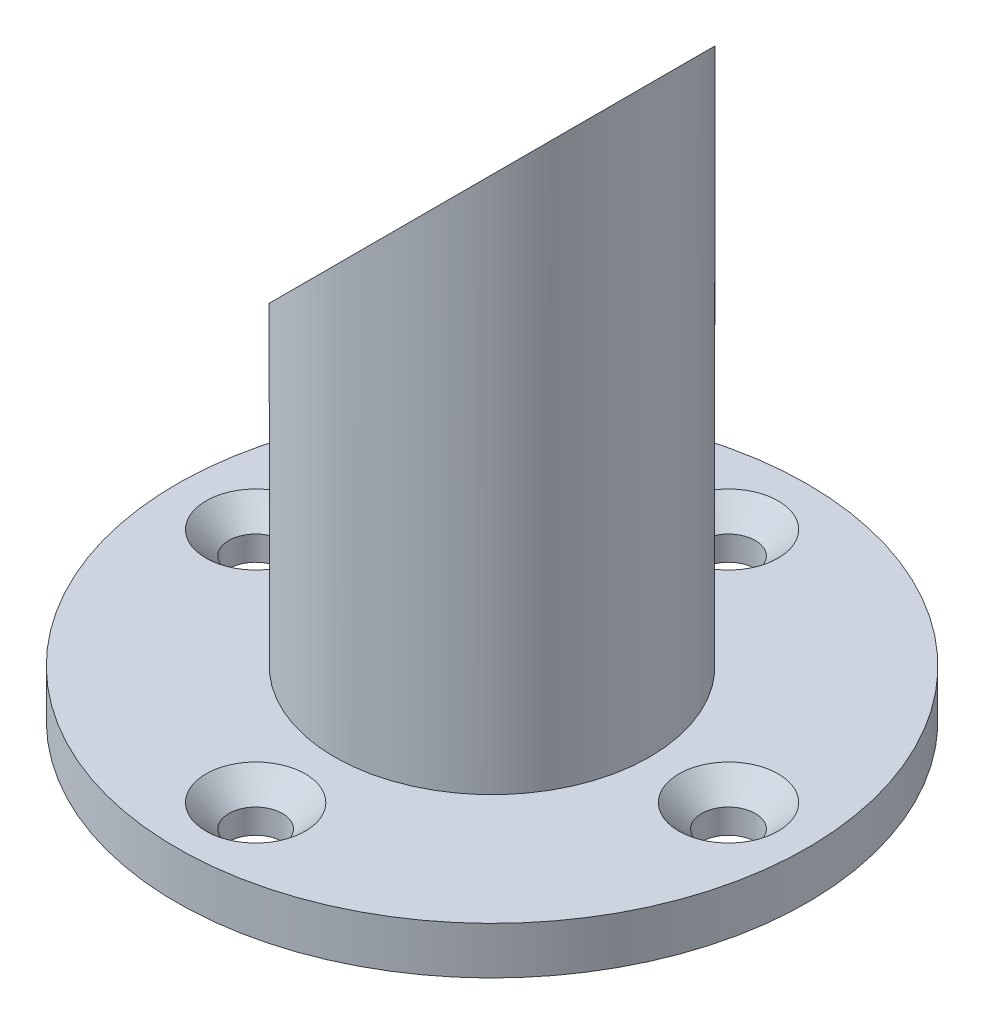
ISO-10303-21;
HEADER;
FILE_DESCRIPTION(('STEP AP214'),'2;1');
FILE_NAME('part.step','',(''),(''),'','','');
FILE_SCHEMA(('AUTOMOTIVE_DESIGN { 1 0 10303 214 1 1 1 1 }'));
ENDSEC;
DATA;
#1=APPLICATION_CONTEXT('core data for automotive mechanical design processes');
#2=APPLICATION_PROTOCOL_DEFINITION('international standard','automotive_design',2000,#1);
#3=PRODUCT_CONTEXT('',#1,'mechanical');
#4=PRODUCT('Part','Part','',(#3));
#5=PRODUCT_RELATED_PRODUCT_CATEGORY('part','',(#4));
#6=PRODUCT_DEFINITION_FORMATION('','',#4);
#7=PRODUCT_DEFINITION_CONTEXT('part definition',#1,'design');
#8=PRODUCT_DEFINITION('design','',#6,#7);
#9=PRODUCT_DEFINITION_SHAPE('','',#8);
#10=(LENGTH_UNIT() NAMED_UNIT(*) SI_UNIT(.MILLI.,.METRE.));
#11=(NAMED_UNIT(*) PLANE_ANGLE_UNIT() SI_UNIT($,.RADIAN.));
#12=(NAMED_UNIT(*) SI_UNIT($,.STERADIAN.) SOLID_ANGLE_UNIT());
#13=UNCERTAINTY_MEASURE_WITH_UNIT(LENGTH_MEASURE(1.E-05),#10,'distance_accuracy_value','');
#14=(GEOMETRIC_REPRESENTATION_CONTEXT(3) GLOBAL_UNCERTAINTY_ASSIGNED_CONTEXT((#13)) GLOBAL_UNIT_ASSIGNED_CONTEXT((#10,
#11,#12)) REPRESENTATION_CONTEXT('',''));
#15=CARTESIAN_POINT('',(0.,0.,0.));
#16=DIRECTION('',(0.,0.,1.));
#17=DIRECTION('',(1.,0.,0.));
#18=AXIS2_PLACEMENT_3D('',#15,#16,#17);
#19=CARTESIAN_POINT('',(0.,40.,0.));
#20=DIRECTION('',(0.,-1.,0.));
#21=DIRECTION('',(0.,0.,-1.));
#22=AXIS2_PLACEMENT_3D('',#19,#20,#21);
#23=CYLINDRICAL_SURFACE('',#22,10.);
#24=CARTESIAN_POINT('',(0.,30.,0.));
#25=DIRECTION('',(0.707106781186548,-0.707106781186548,0.));
#26=DIRECTION('',(-0.707106781186548,-0.707106781186548,0.));
#27=AXIS2_PLACEMENT_3D('',#24,#25,#26);
#28=ELLIPSE('',#27,14.1421356237309,10.);
#29=CARTESIAN_POINT('',(-10.,20.,0.));
#30=VERTEX_POINT('',#29);
#31=EDGE_CURVE('E66',#30,#30,#28,.T.);
#32=ORIENTED_EDGE('',*,*,#31,.T.);
#33=EDGE_LOOP('',(#32));
#34=FACE_BOUND('',#33,.T.);
#35=CARTESIAN_POINT('',(0.,3.,0.));
#36=DIRECTION('',(0.,-1.,0.));
#37=DIRECTION('',(0.,0.,-1.));
#38=AXIS2_PLACEMENT_3D('',#35,#36,#37);
#39=CIRCLE('',#38,10.);
#40=CARTESIAN_POINT('',(0.,3.,-10.));
#41=VERTEX_POINT('',#40);
#42=EDGE_CURVE('E13',#41,#41,#39,.T.);
#43=ORIENTED_EDGE('',*,*,#42,.F.);
#44=EDGE_LOOP('',(#43));
#45=FACE_BOUND('',#44,.T.);
#46=ADVANCED_FACE('F47',(#34,#45),#23,.T.);
#47=CARTESIAN_POINT('',(0.,3.,0.));
#48=DIRECTION('',(0.,-1.,0.));
#49=DIRECTION('',(0.,0.,-1.));
#50=AXIS2_PLACEMENT_3D('',#47,#48,#49);
#51=CYLINDRICAL_SURFACE('',#50,20.);
#52=CARTESIAN_POINT('',(0.,3.,0.));
#53=DIRECTION('',(0.,-1.,0.));
#54=DIRECTION('',(0.,0.,-1.));
#55=AXIS2_PLACEMENT_3D('',#52,#53,#54);
#56=CIRCLE('',#55,20.);
#57=CARTESIAN_POINT('',(0.,3.,-20.));
#58=VERTEX_POINT('',#57);
#59=EDGE_CURVE('E53',#58,#58,#56,.T.);
#60=ORIENTED_EDGE('',*,*,#59,.T.);
#61=EDGE_LOOP('',(#60));
#62=FACE_BOUND('',#61,.T.);
#63=CARTESIAN_POINT('',(0.,0.,0.));
#64=DIRECTION('',(0.,-1.,0.));
#65=DIRECTION('',(0.,0.,-1.));
#66=AXIS2_PLACEMENT_3D('',#63,#64,#65);
#67=CIRCLE('',#66,20.);
#68=CARTESIAN_POINT('',(0.,0.,-20.));
#69=VERTEX_POINT('',#68);
#70=EDGE_CURVE('E110',#69,#69,#67,.T.);
#71=ORIENTED_EDGE('',*,*,#70,.F.);
#72=EDGE_LOOP('',(#71));
#73=FACE_BOUND('',#72,.T.);
#74=ADVANCED_FACE('F117',(#62,#73),#51,.T.);
#75=CARTESIAN_POINT('',(0.,3.,0.));
#76=DIRECTION('',(0.,-1.,0.));
#77=DIRECTION('',(0.,0.,-1.));
#78=AXIS2_PLACEMENT_3D('',#75,#76,#77);
#79=PLANE('',#78);
#80=CARTESIAN_POINT('',(-15.,3.,-1.57116660247941E-13));
#81=DIRECTION('',(0.,1.,0.));
#82=DIRECTION('',(0.,0.,1.));
#83=AXIS2_PLACEMENT_3D('',#80,#81,#82);
#84=CIRCLE('',#83,3.15);
#85=CARTESIAN_POINT('',(-15.,3.,3.14999999999984));
#86=VERTEX_POINT('',#85);
#87=EDGE_CURVE('E70',#86,#86,#84,.T.);
#88=ORIENTED_EDGE('',*,*,#87,.F.);
#89=EDGE_LOOP('',(#88));
#90=FACE_BOUND('',#89,.T.);
#91=CARTESIAN_POINT('',(0.,3.,15.));
#92=DIRECTION('',(0.,1.,0.));
#93=DIRECTION('',(0.,0.,1.));
#94=AXIS2_PLACEMENT_3D('',#91,#92,#93);
#95=CIRCLE('',#94,3.15);
#96=CARTESIAN_POINT('',(0.,3.,18.15));
#97=VERTEX_POINT('',#96);
#98=EDGE_CURVE('E83',#97,#97,#95,.T.);
#99=ORIENTED_EDGE('',*,*,#98,.F.);
#100=EDGE_LOOP('',(#99));
#101=FACE_BOUND('',#100,.T.);
#102=CARTESIAN_POINT('',(15.,3.,0.));
#103=DIRECTION('',(0.,1.,0.));
#104=DIRECTION('',(0.,0.,1.));
#105=AXIS2_PLACEMENT_3D('',#102,#103,#104);
#106=CIRCLE('',#105,3.15);
#107=CARTESIAN_POINT('',(15.,3.,3.15000000000005));
#108=VERTEX_POINT('',#107);
#109=EDGE_CURVE('E92',#108,#108,#106,.T.);
#110=ORIENTED_EDGE('',*,*,#109,.F.);
#111=EDGE_LOOP('',(#110));
#112=FACE_BOUND('',#111,.T.);
#113=CARTESIAN_POINT('',(0.,3.,-15.));
#114=DIRECTION('',(0.,1.,0.));
#115=DIRECTION('',(0.,0.,1.));
#116=AXIS2_PLACEMENT_3D('',#113,#114,#115);
#117=CIRCLE('',#116,3.15);
#118=CARTESIAN_POINT('',(0.,3.,-11.85));
#119=VERTEX_POINT('',#118);
#120=EDGE_CURVE('E101',#119,#119,#117,.T.);
#121=ORIENTED_EDGE('',*,*,#120,.F.);
#122=EDGE_LOOP('',(#121));
#123=FACE_BOUND('',#122,.T.);
#124=ORIENTED_EDGE('',*,*,#42,.T.);
#125=EDGE_LOOP('',(#124));
#126=FACE_BOUND('',#125,.T.);
#127=ORIENTED_EDGE('',*,*,#59,.F.);
#128=EDGE_LOOP('',(#127));
#129=FACE_BOUND('',#128,.T.);
#130=ADVANCED_FACE('F119',(#90,#101,#112,#123,#126,#129),#79,.F.);
#131=CARTESIAN_POINT('',(0.,0.,0.));
#132=DIRECTION('',(0.,1.,0.));
#133=DIRECTION('',(0.,0.,1.));
#134=AXIS2_PLACEMENT_3D('',#131,#132,#133);
#135=PLANE('',#134);
#136=CARTESIAN_POINT('',(-15.,0.,-1.57116660247941E-13));
#137=DIRECTION('',(0.,1.,0.));
#138=DIRECTION('',(0.,0.,1.));
#139=AXIS2_PLACEMENT_3D('',#136,#137,#138);
#140=CIRCLE('',#139,1.7);
#141=CARTESIAN_POINT('',(-15.,0.,1.69999999999984));
#142=VERTEX_POINT('',#141);
#143=EDGE_CURVE('E80',#142,#142,#140,.T.);
#144=ORIENTED_EDGE('',*,*,#143,.T.);
#145=EDGE_LOOP('',(#144));
#146=FACE_BOUND('',#145,.T.);
#147=CARTESIAN_POINT('',(0.,0.,15.));
#148=DIRECTION('',(0.,1.,0.));
#149=DIRECTION('',(0.,0.,1.));
#150=AXIS2_PLACEMENT_3D('',#147,#148,#149);
#151=CIRCLE('',#150,1.7);
#152=CARTESIAN_POINT('',(0.,0.,16.7));
#153=VERTEX_POINT('',#152);
#154=EDGE_CURVE('E89',#153,#153,#151,.T.);
#155=ORIENTED_EDGE('',*,*,#154,.T.);
#156=EDGE_LOOP('',(#155));
#157=FACE_BOUND('',#156,.T.);
#158=CARTESIAN_POINT('',(15.,0.,0.));
#159=DIRECTION('',(0.,1.,0.));
#160=DIRECTION('',(0.,0.,1.));
#161=AXIS2_PLACEMENT_3D('',#158,#159,#160);
#162=CIRCLE('',#161,1.7);
#163=CARTESIAN_POINT('',(15.,0.,1.70000000000005));
#164=VERTEX_POINT('',#163);
#165=EDGE_CURVE('E98',#164,#164,#162,.T.);
#166=ORIENTED_EDGE('',*,*,#165,.T.);
#167=EDGE_LOOP('',(#166));
#168=FACE_BOUND('',#167,.T.);
#169=CARTESIAN_POINT('',(0.,0.,-15.));
#170=DIRECTION('',(0.,1.,0.));
#171=DIRECTION('',(0.,0.,1.));
#172=AXIS2_PLACEMENT_3D('',#169,#170,#171);
#173=CIRCLE('',#172,1.7);
#174=CARTESIAN_POINT('',(0.,0.,-13.3));
#175=VERTEX_POINT('',#174);
#176=EDGE_CURVE('E107',#175,#175,#173,.T.);
#177=ORIENTED_EDGE('',*,*,#176,.T.);
#178=EDGE_LOOP('',(#177));
#179=FACE_BOUND('',#178,.T.);
#180=ORIENTED_EDGE('',*,*,#70,.T.);
#181=EDGE_LOOP('',(#180));
#182=FACE_BOUND('',#181,.T.);
#183=ADVANCED_FACE('F115',(#146,#157,#168,#179,#182),#135,.F.);
#184=CARTESIAN_POINT('',(0.,3.,-15.));
#185=DIRECTION('',(0.,1.,0.));
#186=DIRECTION('',(0.,0.,1.));
#187=AXIS2_PLACEMENT_3D('',#184,#185,#186);
#188=CYLINDRICAL_SURFACE('',#187,1.7);
#189=ORIENTED_EDGE('',*,*,#176,.F.);
#190=EDGE_LOOP('',(#189));
#191=FACE_BOUND('',#190,.T.);
#192=CARTESIAN_POINT('',(0.,1.55,-15.));
#193=DIRECTION('',(0.,1.,0.));
#194=DIRECTION('',(0.,0.,1.));
#195=AXIS2_PLACEMENT_3D('',#192,#193,#194);
#196=CIRCLE('',#195,1.7);
#197=CARTESIAN_POINT('',(0.,1.55,-13.3));
#198=VERTEX_POINT('',#197);
#199=EDGE_CURVE('E104',#198,#198,#196,.T.);
#200=ORIENTED_EDGE('',*,*,#199,.T.);
#201=EDGE_LOOP('',(#200));
#202=FACE_BOUND('',#201,.T.);
#203=ADVANCED_FACE('F131',(#191,#202),#188,.F.);
#204=CARTESIAN_POINT('',(0.,3.,-15.));
#205=DIRECTION('',(0.,1.,0.));
#206=DIRECTION('',(0.,0.,1.));
#207=AXIS2_PLACEMENT_3D('',#204,#205,#206);
#208=CONICAL_SURFACE('',#207,3.15,0.785398163397448);
#209=ORIENTED_EDGE('',*,*,#199,.F.);
#210=EDGE_LOOP('',(#209));
#211=FACE_BOUND('',#210,.T.);
#212=ORIENTED_EDGE('',*,*,#120,.T.);
#213=EDGE_LOOP('',(#212));
#214=FACE_BOUND('',#213,.T.);
#215=ADVANCED_FACE('F136',(#211,#214),#208,.F.);
#216=CARTESIAN_POINT('',(15.,3.,0.));
#217=DIRECTION('',(0.,1.,0.));
#218=DIRECTION('',(0.,0.,1.));
#219=AXIS2_PLACEMENT_3D('',#216,#217,#218);
#220=CYLINDRICAL_SURFACE('',#219,1.7);
#221=ORIENTED_EDGE('',*,*,#165,.F.);
#222=EDGE_LOOP('',(#221));
#223=FACE_BOUND('',#222,.T.);
#224=CARTESIAN_POINT('',(15.,1.55,0.));
#225=DIRECTION('',(0.,1.,0.));
#226=DIRECTION('',(0.,0.,1.));
#227=AXIS2_PLACEMENT_3D('',#224,#225,#226);
#228=CIRCLE('',#227,1.7);
#229=CARTESIAN_POINT('',(15.,1.55,1.70000000000005));
#230=VERTEX_POINT('',#229);
#231=EDGE_CURVE('E95',#230,#230,#228,.T.);
#232=ORIENTED_EDGE('',*,*,#231,.T.);
#233=EDGE_LOOP('',(#232));
#234=FACE_BOUND('',#233,.T.);
#235=ADVANCED_FACE('F150',(#223,#234),#220,.F.);
#236=CARTESIAN_POINT('',(15.,3.,0.));
#237=DIRECTION('',(0.,1.,0.));
#238=DIRECTION('',(0.,0.,1.));
#239=AXIS2_PLACEMENT_3D('',#236,#237,#238);
#240=CONICAL_SURFACE('',#239,3.15,0.785398163397448);
#241=ORIENTED_EDGE('',*,*,#231,.F.);
#242=EDGE_LOOP('',(#241));
#243=FACE_BOUND('',#242,.T.);
#244=ORIENTED_EDGE('',*,*,#109,.T.);
#245=EDGE_LOOP('',(#244));
#246=FACE_BOUND('',#245,.T.);
#247=ADVANCED_FACE('F162',(#243,#246),#240,.F.);
#248=CARTESIAN_POINT('',(0.,3.,15.));
#249=DIRECTION('',(0.,1.,0.));
#250=DIRECTION('',(0.,0.,1.));
#251=AXIS2_PLACEMENT_3D('',#248,#249,#250);
#252=CYLINDRICAL_SURFACE('',#251,1.7);
#253=ORIENTED_EDGE('',*,*,#154,.F.);
#254=EDGE_LOOP('',(#253));
#255=FACE_BOUND('',#254,.T.);
#256=CARTESIAN_POINT('',(0.,1.55,15.));
#257=DIRECTION('',(0.,1.,0.));
#258=DIRECTION('',(0.,0.,1.));
#259=AXIS2_PLACEMENT_3D('',#256,#257,#258);
#260=CIRCLE('',#259,1.7);
#261=CARTESIAN_POINT('',(0.,1.55,16.7));
#262=VERTEX_POINT('',#261);
#263=EDGE_CURVE('E86',#262,#262,#260,.T.);
#264=ORIENTED_EDGE('',*,*,#263,.T.);
#265=EDGE_LOOP('',(#264));
#266=FACE_BOUND('',#265,.T.);
#267=ADVANCED_FACE('F168',(#255,#266),#252,.F.);
#268=CARTESIAN_POINT('',(0.,3.,15.));
#269=DIRECTION('',(0.,1.,0.));
#270=DIRECTION('',(0.,0.,1.));
#271=AXIS2_PLACEMENT_3D('',#268,#269,#270);
#272=CONICAL_SURFACE('',#271,3.15,0.785398163397448);
#273=ORIENTED_EDGE('',*,*,#263,.F.);
#274=EDGE_LOOP('',(#273));
#275=FACE_BOUND('',#274,.T.);
#276=ORIENTED_EDGE('',*,*,#98,.T.);
#277=EDGE_LOOP('',(#276));
#278=FACE_BOUND('',#277,.T.);
#279=ADVANCED_FACE('F172',(#275,#278),#272,.F.);
#280=CARTESIAN_POINT('',(-15.,3.,-1.57116660247941E-13));
#281=DIRECTION('',(0.,1.,0.));
#282=DIRECTION('',(0.,0.,1.));
#283=AXIS2_PLACEMENT_3D('',#280,#281,#282);
#284=CYLINDRICAL_SURFACE('',#283,1.7);
#285=ORIENTED_EDGE('',*,*,#143,.F.);
#286=EDGE_LOOP('',(#285));
#287=FACE_BOUND('',#286,.T.);
#288=CARTESIAN_POINT('',(-15.,1.55,-1.57116660247941E-13));
#289=DIRECTION('',(0.,1.,0.));
#290=DIRECTION('',(0.,0.,1.));
#291=AXIS2_PLACEMENT_3D('',#288,#289,#290);
#292=CIRCLE('',#291,1.7);
#293=CARTESIAN_POINT('',(-15.,1.55,1.69999999999984));
#294=VERTEX_POINT('',#293);
#295=EDGE_CURVE('E77',#294,#294,#292,.T.);
#296=ORIENTED_EDGE('',*,*,#295,.T.);
#297=EDGE_LOOP('',(#296));
#298=FACE_BOUND('',#297,.T.);
#299=ADVANCED_FACE('F176',(#287,#298),#284,.F.);
#300=CARTESIAN_POINT('',(-15.,3.,-1.57116660247941E-13));
#301=DIRECTION('',(0.,1.,0.));
#302=DIRECTION('',(0.,0.,1.));
#303=AXIS2_PLACEMENT_3D('',#300,#301,#302);
#304=CONICAL_SURFACE('',#303,3.15,0.785398163397448);
#305=ORIENTED_EDGE('',*,*,#295,.F.);
#306=EDGE_LOOP('',(#305));
#307=FACE_BOUND('',#306,.T.);
#308=ORIENTED_EDGE('',*,*,#87,.T.);
#309=EDGE_LOOP('',(#308));
#310=FACE_BOUND('',#309,.T.);
#311=ADVANCED_FACE('F180',(#307,#310),#304,.F.);
#312=CARTESIAN_POINT('',(10.,40.,-20.));
#313=DIRECTION('',(0.707106781186548,-0.707106781186548,0.));
#314=DIRECTION('',(0.707106781186548,0.707106781186548,0.));
#315=AXIS2_PLACEMENT_3D('',#312,#313,#314);
#316=PLANE('',#315);
#317=CARTESIAN_POINT('',(0.,30.,0.));
#318=DIRECTION('',(-0.707106781186548,0.707106781186547,0.));
#319=DIRECTION('',(-0.707106781186547,-0.707106781186548,0.));
#320=AXIS2_PLACEMENT_3D('',#317,#318,#319);
#321=CIRCLE('',#320,2.5);
#322=CARTESIAN_POINT('',(-1.76776695296638,28.2322330470336,0.));
#323=VERTEX_POINT('',#322);
#324=EDGE_CURVE('E67',#323,#323,#321,.T.);
#325=ORIENTED_EDGE('',*,*,#324,.F.);
#326=EDGE_LOOP('',(#325));
#327=FACE_BOUND('',#326,.T.);
#328=ORIENTED_EDGE('',*,*,#31,.F.);
#329=EDGE_LOOP('',(#328));
#330=FACE_BOUND('',#329,.T.);
#331=ADVANCED_FACE('F60',(#327,#330),#316,.F.);
#332=CARTESIAN_POINT('',(7.07106781186547,22.9289321881345,0.));
#333=DIRECTION('',(-0.707106781186548,0.707106781186547,0.));
#334=DIRECTION('',(-0.707106781186547,-0.707106781186548,0.));
#335=AXIS2_PLACEMENT_3D('',#332,#333,#334);
#336=CONICAL_SURFACE('',#335,2.5,1.02974425867665);
#337=CARTESIAN_POINT('',(8.1332493575213,21.8667506424787,0.));
#338=VERTEX_POINT('',#337);
#339=VERTEX_LOOP('',#338);
#340=FACE_BOUND('',#339,.T.);
#341=CARTESIAN_POINT('',(7.07106781186547,22.9289321881345,0.));
#342=DIRECTION('',(-0.707106781186548,0.707106781186547,0.));
#343=DIRECTION('',(-0.707106781186547,-0.707106781186548,0.));
#344=AXIS2_PLACEMENT_3D('',#341,#342,#343);
#345=CIRCLE('',#344,2.5);
#346=CARTESIAN_POINT('',(5.3033008588991,21.1611652351682,0.));
#347=VERTEX_POINT('',#346);
#348=EDGE_CURVE('E64',#347,#347,#345,.T.);
#349=ORIENTED_EDGE('',*,*,#348,.T.);
#350=EDGE_LOOP('',(#349));
#351=FACE_BOUND('',#350,.T.);
#352=ADVANCED_FACE('F56',(#340,#351),#336,.F.);
#353=CARTESIAN_POINT('',(0.,30.,0.));
#354=DIRECTION('',(-0.707106781186548,0.707106781186547,0.));
#355=DIRECTION('',(-0.707106781186547,-0.707106781186548,0.));
#356=AXIS2_PLACEMENT_3D('',#353,#354,#355);
#357=CYLINDRICAL_SURFACE('',#356,2.5);
#358=ORIENTED_EDGE('',*,*,#348,.F.);
#359=EDGE_LOOP('',(#358));
#360=FACE_BOUND('',#359,.T.);
#361=ORIENTED_EDGE('',*,*,#324,.T.);
#362=EDGE_LOOP('',(#361));
#363=FACE_BOUND('',#362,.T.);
#364=ADVANCED_FACE('F59',(#360,#363),#357,.F.);
#365=CLOSED_SHELL('',(#46,#74,#130,#183,#203,#215,#235,#247,#267,#279,#299,#311,#331,#352,#364));
#366=MANIFOLD_SOLID_BREP('B2',#365);
#367=ADVANCED_BREP_SHAPE_REPRESENTATION('',(#18,#366),#14);
#368=SHAPE_DEFINITION_REPRESENTATION(#9,#367);
ENDSEC;
END-ISO-10303-21;
